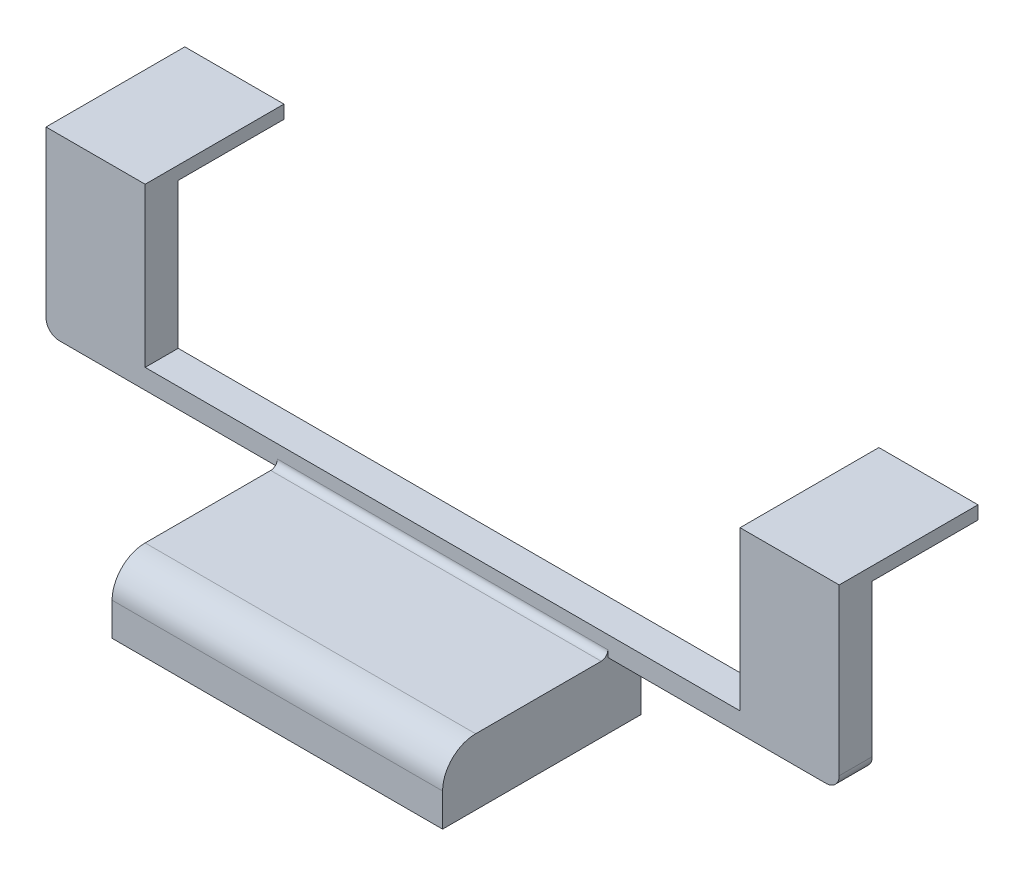
ISO-10303-21;
HEADER;
FILE_DESCRIPTION(('STEP AP214'),'2;1');
FILE_NAME('part.step','',(''),(''),'','','');
FILE_SCHEMA(('AUTOMOTIVE_DESIGN { 1 0 10303 214 1 1 1 1 }'));
ENDSEC;
DATA;
#1=APPLICATION_CONTEXT('core data for automotive mechanical design processes');
#2=APPLICATION_PROTOCOL_DEFINITION('international standard','automotive_design',2000,#1);
#3=PRODUCT_CONTEXT('',#1,'mechanical');
#4=PRODUCT('Part','Part','',(#3));
#5=PRODUCT_RELATED_PRODUCT_CATEGORY('part','',(#4));
#6=PRODUCT_DEFINITION_FORMATION('','',#4);
#7=PRODUCT_DEFINITION_CONTEXT('part definition',#1,'design');
#8=PRODUCT_DEFINITION('design','',#6,#7);
#9=PRODUCT_DEFINITION_SHAPE('','',#8);
#10=(LENGTH_UNIT() NAMED_UNIT(*) SI_UNIT(.MILLI.,.METRE.));
#11=(NAMED_UNIT(*) PLANE_ANGLE_UNIT() SI_UNIT($,.RADIAN.));
#12=(NAMED_UNIT(*) SI_UNIT($,.STERADIAN.) SOLID_ANGLE_UNIT());
#13=UNCERTAINTY_MEASURE_WITH_UNIT(LENGTH_MEASURE(1.E-05),#10,'distance_accuracy_value','');
#14=(GEOMETRIC_REPRESENTATION_CONTEXT(3) GLOBAL_UNCERTAINTY_ASSIGNED_CONTEXT((#13)) GLOBAL_UNIT_ASSIGNED_CONTEXT((#10,
#11,#12)) REPRESENTATION_CONTEXT('',''));
#15=CARTESIAN_POINT('',(0.,0.,0.));
#16=DIRECTION('',(0.,0.,1.));
#17=DIRECTION('',(1.,0.,0.));
#18=AXIS2_PLACEMENT_3D('',#15,#16,#17);
#19=CARTESIAN_POINT('',(-55.7739775783873,3.,26.4775882041113));
#20=DIRECTION('',(0.,0.,1.));
#21=DIRECTION('',(1.,0.,0.));
#22=AXIS2_PLACEMENT_3D('',#19,#20,#21);
#23=PLANE('',#22);
#24=DIRECTION('',(-1.,0.,0.));
#25=VECTOR('',#24,1.);
#26=CARTESIAN_POINT('',(-55.7739775783873,25.,26.4775882041113));
#27=LINE('',#26,#25);
#28=CARTESIAN_POINT('',(-40.7739775783873,25.,26.4775882041113));
#29=VERTEX_POINT('',#28);
#30=CARTESIAN_POINT('',(-55.7739775783873,25.,26.4775882041113));
#31=VERTEX_POINT('',#30);
#32=EDGE_CURVE('E227',#29,#31,#27,.T.);
#33=ORIENTED_EDGE('',*,*,#32,.F.);
#34=DIRECTION('',(0.,-1.,0.));
#35=VECTOR('',#34,1.);
#36=CARTESIAN_POINT('',(-40.7739775783873,27.,26.4775882041113));
#37=LINE('',#36,#35);
#38=CARTESIAN_POINT('',(-40.7739775783873,3.,26.4775882041113));
#39=VERTEX_POINT('',#38);
#40=EDGE_CURVE('E334',#29,#39,#37,.T.);
#41=ORIENTED_EDGE('',*,*,#40,.T.);
#42=DIRECTION('',(-1.,0.,0.));
#43=VECTOR('',#42,1.);
#44=CARTESIAN_POINT('',(-55.7739775783873,3.,26.4775882041113));
#45=LINE('',#44,#43);
#46=CARTESIAN_POINT('',(49.2260224216127,3.,26.4775882041113));
#47=VERTEX_POINT('',#46);
#48=EDGE_CURVE('E344',#47,#39,#45,.T.);
#49=ORIENTED_EDGE('',*,*,#48,.F.);
#50=DIRECTION('',(0.,-1.,0.));
#51=VECTOR('',#50,1.);
#52=CARTESIAN_POINT('',(49.2260224216127,27.,26.4775882041113));
#53=LINE('',#52,#51);
#54=CARTESIAN_POINT('',(49.2260224216127,25.,26.4775882041113));
#55=VERTEX_POINT('',#54);
#56=EDGE_CURVE('E326',#55,#47,#53,.T.);
#57=ORIENTED_EDGE('',*,*,#56,.F.);
#58=DIRECTION('',(-1.,0.,0.));
#59=VECTOR('',#58,1.);
#60=CARTESIAN_POINT('',(64.2260224216127,25.,26.4775882041113));
#61=LINE('',#60,#59);
#62=CARTESIAN_POINT('',(64.2260224216127,25.,26.4775882041113));
#63=VERTEX_POINT('',#62);
#64=EDGE_CURVE('E50',#63,#55,#61,.T.);
#65=ORIENTED_EDGE('',*,*,#64,.F.);
#66=DIRECTION('',(0.,-1.,0.));
#67=VECTOR('',#66,1.);
#68=CARTESIAN_POINT('',(64.2260224216127,3.,26.4775882041113));
#69=LINE('',#68,#67);
#70=CARTESIAN_POINT('',(64.2260224216127,2.,26.4775882041113));
#71=VERTEX_POINT('',#70);
#72=EDGE_CURVE('E354',#63,#71,#69,.T.);
#73=ORIENTED_EDGE('',*,*,#72,.T.);
#74=CARTESIAN_POINT('',(62.2260224216127,2.,26.4775882041113));
#75=DIRECTION('',(0.,0.,1.));
#76=DIRECTION('',(1.,0.,0.));
#77=AXIS2_PLACEMENT_3D('',#74,#75,#76);
#78=CIRCLE('',#77,2.);
#79=CARTESIAN_POINT('',(62.2260224216127,0.,26.4775882041113));
#80=VERTEX_POINT('',#79);
#81=EDGE_CURVE('E389',#71,#80,#78,.F.);
#82=ORIENTED_EDGE('',*,*,#81,.T.);
#83=DIRECTION('',(-1.,0.,0.));
#84=VECTOR('',#83,1.);
#85=CARTESIAN_POINT('',(-55.7739775783873,0.,26.4775882041113));
#86=LINE('',#85,#84);
#87=CARTESIAN_POINT('',(29.2260224216127,0.,26.4775882041113));
#88=VERTEX_POINT('',#87);
#89=EDGE_CURVE('E345',#80,#88,#86,.T.);
#90=ORIENTED_EDGE('',*,*,#89,.T.);
#91=DIRECTION('',(0.,1.,0.));
#92=VECTOR('',#91,1.);
#93=CARTESIAN_POINT('',(29.2260224216127,-10.,26.4775882041113));
#94=LINE('',#93,#92);
#95=CARTESIAN_POINT('',(29.2260224216127,-10.,26.4775882041113));
#96=VERTEX_POINT('',#95);
#97=EDGE_CURVE('E307',#96,#88,#94,.T.);
#98=ORIENTED_EDGE('',*,*,#97,.F.);
#99=DIRECTION('',(1.,0.,0.));
#100=VECTOR('',#99,1.);
#101=CARTESIAN_POINT('',(29.2260224216127,-10.,26.4775882041113));
#102=LINE('',#101,#100);
#103=CARTESIAN_POINT('',(-20.7739775783873,-10.,26.4775882041113));
#104=VERTEX_POINT('',#103);
#105=EDGE_CURVE('E289',#104,#96,#102,.T.);
#106=ORIENTED_EDGE('',*,*,#105,.F.);
#107=DIRECTION('',(0.,1.,0.));
#108=VECTOR('',#107,1.);
#109=CARTESIAN_POINT('',(-20.7739775783873,-10.,26.4775882041113));
#110=LINE('',#109,#108);
#111=CARTESIAN_POINT('',(-20.7739775783873,0.,26.4775882041113));
#112=VERTEX_POINT('',#111);
#113=EDGE_CURVE('E310',#104,#112,#110,.T.);
#114=ORIENTED_EDGE('',*,*,#113,.T.);
#115=CARTESIAN_POINT('',(-53.7739775783873,0.,26.4775882041113));
#116=VERTEX_POINT('',#115);
#117=EDGE_CURVE('E351',#112,#116,#86,.T.);
#118=ORIENTED_EDGE('',*,*,#117,.T.);
#119=CARTESIAN_POINT('',(-53.7739775783873,2.,26.4775882041113));
#120=DIRECTION('',(0.,0.,1.));
#121=DIRECTION('',(1.,0.,0.));
#122=AXIS2_PLACEMENT_3D('',#119,#120,#121);
#123=CIRCLE('',#122,2.);
#124=CARTESIAN_POINT('',(-55.7739775783873,2.,26.4775882041113));
#125=VERTEX_POINT('',#124);
#126=EDGE_CURVE('E11',#116,#125,#123,.F.);
#127=ORIENTED_EDGE('',*,*,#126,.T.);
#128=DIRECTION('',(0.,-1.,0.));
#129=VECTOR('',#128,1.);
#130=CARTESIAN_POINT('',(-55.7739775783873,3.,26.4775882041113));
#131=LINE('',#130,#129);
#132=EDGE_CURVE('E348',#31,#125,#131,.T.);
#133=ORIENTED_EDGE('',*,*,#132,.F.);
#134=EDGE_LOOP('',(#33,#41,#49,#57,#65,#73,#82,#90,#98,#106,#114,#118,#127,#133));
#135=FACE_BOUND('',#134,.T.);
#136=ADVANCED_FACE('F35',(#135),#23,.F.);
#137=CARTESIAN_POINT('',(0.,0.,0.));
#138=DIRECTION('',(0.,-1.,0.));
#139=DIRECTION('',(0.,0.,-1.));
#140=AXIS2_PLACEMENT_3D('',#137,#138,#139);
#141=PLANE('',#140);
#142=DIRECTION('',(1.,0.,0.));
#143=VECTOR('',#142,1.);
#144=CARTESIAN_POINT('',(64.2260224216127,0.,31.4775882041113));
#145=LINE('',#144,#143);
#146=CARTESIAN_POINT('',(-53.7739775783873,0.,31.4775882041113));
#147=VERTEX_POINT('',#146);
#148=CARTESIAN_POINT('',(-20.7739775783873,0.,31.4775882041113));
#149=VERTEX_POINT('',#148);
#150=EDGE_CURVE('E349',#147,#149,#145,.T.);
#151=ORIENTED_EDGE('',*,*,#150,.F.);
#152=DIRECTION('',(0.,0.,1.));
#153=VECTOR('',#152,1.);
#154=CARTESIAN_POINT('',(-53.7739775783873,0.,26.4775882041113));
#155=LINE('',#154,#153);
#156=EDGE_CURVE('E43',#147,#116,#155,.F.);
#157=ORIENTED_EDGE('',*,*,#156,.T.);
#158=ORIENTED_EDGE('',*,*,#117,.F.);
#159=DIRECTION('',(0.,0.,-1.));
#160=VECTOR('',#159,1.);
#161=CARTESIAN_POINT('',(-20.7739775783873,0.,26.4775882041113));
#162=LINE('',#161,#160);
#163=EDGE_CURVE('E299',#149,#112,#162,.T.);
#164=ORIENTED_EDGE('',*,*,#163,.F.);
#165=EDGE_LOOP('',(#151,#157,#158,#164));
#166=FACE_BOUND('',#165,.T.);
#167=ADVANCED_FACE('F403',(#166),#141,.T.);
#168=CARTESIAN_POINT('',(0.,3.,0.));
#169=DIRECTION('',(0.,-1.,0.));
#170=DIRECTION('',(0.,0.,-1.));
#171=AXIS2_PLACEMENT_3D('',#168,#169,#170);
#172=PLANE('',#171);
#173=DIRECTION('',(0.,0.,1.));
#174=VECTOR('',#173,1.);
#175=CARTESIAN_POINT('',(49.2260224216127,3.,26.4775882041113));
#176=LINE('',#175,#174);
#177=CARTESIAN_POINT('',(49.2260224216127,3.,31.4775882041113));
#178=VERTEX_POINT('',#177);
#179=EDGE_CURVE('E313',#47,#178,#176,.T.);
#180=ORIENTED_EDGE('',*,*,#179,.F.);
#181=ORIENTED_EDGE('',*,*,#48,.T.);
#182=DIRECTION('',(0.,0.,-1.));
#183=VECTOR('',#182,1.);
#184=CARTESIAN_POINT('',(-40.7739775783873,3.,26.4775882041113));
#185=LINE('',#184,#183);
#186=CARTESIAN_POINT('',(-40.7739775783873,3.,31.4775882041113));
#187=VERTEX_POINT('',#186);
#188=EDGE_CURVE('E328',#187,#39,#185,.T.);
#189=ORIENTED_EDGE('',*,*,#188,.F.);
#190=DIRECTION('',(1.,0.,0.));
#191=VECTOR('',#190,1.);
#192=CARTESIAN_POINT('',(64.2260224216127,3.,31.4775882041113));
#193=LINE('',#192,#191);
#194=EDGE_CURVE('E342',#187,#178,#193,.T.);
#195=ORIENTED_EDGE('',*,*,#194,.T.);
#196=EDGE_LOOP('',(#180,#181,#189,#195));
#197=FACE_BOUND('',#196,.T.);
#198=ADVANCED_FACE('F426',(#197),#172,.F.);
#199=CARTESIAN_POINT('',(-55.7739775783873,3.,31.4775882041113));
#200=DIRECTION('',(1.,0.,0.));
#201=DIRECTION('',(0.,0.,-1.));
#202=AXIS2_PLACEMENT_3D('',#199,#200,#201);
#203=PLANE('',#202);
#204=DIRECTION('',(0.,0.,1.));
#205=VECTOR('',#204,1.);
#206=CARTESIAN_POINT('',(-55.7739775783873,27.,31.4775882041113));
#207=LINE('',#206,#205);
#208=CARTESIAN_POINT('',(-55.7739775783873,27.,10.4775882041113));
#209=VERTEX_POINT('',#208);
#210=CARTESIAN_POINT('',(-55.7739775783873,27.,31.4775882041113));
#211=VERTEX_POINT('',#210);
#212=EDGE_CURVE('E214',#209,#211,#207,.T.);
#213=ORIENTED_EDGE('',*,*,#212,.F.);
#214=DIRECTION('',(0.,1.,0.));
#215=VECTOR('',#214,1.);
#216=CARTESIAN_POINT('',(-55.7739775783873,27.,10.4775882041113));
#217=LINE('',#216,#215);
#218=CARTESIAN_POINT('',(-55.7739775783873,25.,10.4775882041113));
#219=VERTEX_POINT('',#218);
#220=EDGE_CURVE('E207',#219,#209,#217,.T.);
#221=ORIENTED_EDGE('',*,*,#220,.F.);
#222=DIRECTION('',(0.,0.,1.));
#223=VECTOR('',#222,1.);
#224=CARTESIAN_POINT('',(-55.7739775783873,25.,10.4775882041113));
#225=LINE('',#224,#223);
#226=EDGE_CURVE('E211',#219,#31,#225,.T.);
#227=ORIENTED_EDGE('',*,*,#226,.T.);
#228=ORIENTED_EDGE('',*,*,#132,.T.);
#229=DIRECTION('',(0.,0.,1.));
#230=VECTOR('',#229,1.);
#231=CARTESIAN_POINT('',(-55.7739775783873,2.,31.4775882041113));
#232=LINE('',#231,#230);
#233=CARTESIAN_POINT('',(-55.7739775783873,2.,31.4775882041113));
#234=VERTEX_POINT('',#233);
#235=EDGE_CURVE('E395',#125,#234,#232,.T.);
#236=ORIENTED_EDGE('',*,*,#235,.T.);
#237=DIRECTION('',(0.,-1.,0.));
#238=VECTOR('',#237,1.);
#239=CARTESIAN_POINT('',(-55.7739775783873,3.,31.4775882041113));
#240=LINE('',#239,#238);
#241=EDGE_CURVE('E359',#211,#234,#240,.T.);
#242=ORIENTED_EDGE('',*,*,#241,.F.);
#243=EDGE_LOOP('',(#213,#221,#227,#228,#236,#242));
#244=FACE_BOUND('',#243,.T.);
#245=ADVANCED_FACE('F209',(#244),#203,.F.);
#246=CARTESIAN_POINT('',(64.2260224216127,3.,31.4775882041113));
#247=DIRECTION('',(0.,0.,-1.));
#248=DIRECTION('',(-1.,0.,0.));
#249=AXIS2_PLACEMENT_3D('',#246,#247,#248);
#250=PLANE('',#249);
#251=ORIENTED_EDGE('',*,*,#241,.T.);
#252=CARTESIAN_POINT('',(-53.7739775783873,2.,31.4775882041113));
#253=DIRECTION('',(0.,0.,-1.));
#254=DIRECTION('',(-1.,0.,0.));
#255=AXIS2_PLACEMENT_3D('',#252,#253,#254);
#256=CIRCLE('',#255,2.);
#257=EDGE_CURVE('E398',#234,#147,#256,.F.);
#258=ORIENTED_EDGE('',*,*,#257,.T.);
#259=ORIENTED_EDGE('',*,*,#150,.T.);
#260=DIRECTION('',(0.,1.,0.));
#261=VECTOR('',#260,1.);
#262=CARTESIAN_POINT('',(-20.7739775783873,-10.,31.4775882041113));
#263=LINE('',#262,#261);
#264=CARTESIAN_POINT('',(-20.7739775783873,1.,31.4775882041113));
#265=VERTEX_POINT('',#264);
#266=EDGE_CURVE('E362',#149,#265,#263,.T.);
#267=ORIENTED_EDGE('',*,*,#266,.T.);
#268=DIRECTION('',(1.,0.,0.));
#269=VECTOR('',#268,1.);
#270=CARTESIAN_POINT('',(64.2260224216127,1.,31.4775882041113));
#271=LINE('',#270,#269);
#272=CARTESIAN_POINT('',(29.2260224216127,1.,31.4775882041113));
#273=VERTEX_POINT('',#272);
#274=EDGE_CURVE('E365',#265,#273,#271,.T.);
#275=ORIENTED_EDGE('',*,*,#274,.T.);
#276=DIRECTION('',(0.,-1.,0.));
#277=VECTOR('',#276,1.);
#278=CARTESIAN_POINT('',(29.2260224216127,-10.,31.4775882041113));
#279=LINE('',#278,#277);
#280=CARTESIAN_POINT('',(29.2260224216127,0.,31.4775882041113));
#281=VERTEX_POINT('',#280);
#282=EDGE_CURVE('E368',#273,#281,#279,.T.);
#283=ORIENTED_EDGE('',*,*,#282,.T.);
#284=CARTESIAN_POINT('',(62.2260224216127,0.,31.4775882041113));
#285=VERTEX_POINT('',#284);
#286=EDGE_CURVE('E341',#281,#285,#145,.T.);
#287=ORIENTED_EDGE('',*,*,#286,.T.);
#288=CARTESIAN_POINT('',(62.2260224216127,2.,31.4775882041113));
#289=DIRECTION('',(0.,0.,-1.));
#290=DIRECTION('',(-1.,0.,0.));
#291=AXIS2_PLACEMENT_3D('',#288,#289,#290);
#292=CIRCLE('',#291,2.);
#293=CARTESIAN_POINT('',(64.2260224216127,2.,31.4775882041113));
#294=VERTEX_POINT('',#293);
#295=EDGE_CURVE('E393',#285,#294,#292,.F.);
#296=ORIENTED_EDGE('',*,*,#295,.T.);
#297=DIRECTION('',(0.,-1.,0.));
#298=VECTOR('',#297,1.);
#299=CARTESIAN_POINT('',(64.2260224216127,3.,31.4775882041113));
#300=LINE('',#299,#298);
#301=CARTESIAN_POINT('',(64.2260224216127,27.,31.4775882041113));
#302=VERTEX_POINT('',#301);
#303=EDGE_CURVE('E356',#302,#294,#300,.T.);
#304=ORIENTED_EDGE('',*,*,#303,.F.);
#305=DIRECTION('',(1.,0.,0.));
#306=VECTOR('',#305,1.);
#307=CARTESIAN_POINT('',(49.2260224216127,27.,31.4775882041113));
#308=LINE('',#307,#306);
#309=CARTESIAN_POINT('',(49.2260224216127,27.,31.4775882041113));
#310=VERTEX_POINT('',#309);
#311=EDGE_CURVE('E318',#310,#302,#308,.T.);
#312=ORIENTED_EDGE('',*,*,#311,.F.);
#313=DIRECTION('',(0.,-1.,0.));
#314=VECTOR('',#313,1.);
#315=CARTESIAN_POINT('',(49.2260224216127,27.,31.4775882041113));
#316=LINE('',#315,#314);
#317=EDGE_CURVE('E321',#310,#178,#316,.T.);
#318=ORIENTED_EDGE('',*,*,#317,.T.);
#319=ORIENTED_EDGE('',*,*,#194,.F.);
#320=DIRECTION('',(0.,-1.,0.));
#321=VECTOR('',#320,1.);
#322=CARTESIAN_POINT('',(-40.7739775783873,27.,31.4775882041113));
#323=LINE('',#322,#321);
#324=CARTESIAN_POINT('',(-40.7739775783873,27.,31.4775882041113));
#325=VERTEX_POINT('',#324);
#326=EDGE_CURVE('E338',#325,#187,#323,.T.);
#327=ORIENTED_EDGE('',*,*,#326,.F.);
#328=DIRECTION('',(1.,0.,0.));
#329=VECTOR('',#328,1.);
#330=CARTESIAN_POINT('',(-40.7739775783873,27.,31.4775882041113));
#331=LINE('',#330,#329);
#332=EDGE_CURVE('E330',#211,#325,#331,.T.);
#333=ORIENTED_EDGE('',*,*,#332,.F.);
#334=EDGE_LOOP('',(#251,#258,#259,#267,#275,#283,#287,#296,#304,#312,#318,#319,#327,#333));
#335=FACE_BOUND('',#334,.T.);
#336=ADVANCED_FACE('F412',(#335),#250,.F.);
#337=CARTESIAN_POINT('',(64.2260224216127,3.,26.4775882041113));
#338=DIRECTION('',(-1.,0.,0.));
#339=DIRECTION('',(0.,0.,1.));
#340=AXIS2_PLACEMENT_3D('',#337,#338,#339);
#341=PLANE('',#340);
#342=ORIENTED_EDGE('',*,*,#303,.T.);
#343=DIRECTION('',(0.,0.,-1.));
#344=VECTOR('',#343,1.);
#345=CARTESIAN_POINT('',(64.2260224216127,2.,26.4775882041113));
#346=LINE('',#345,#344);
#347=EDGE_CURVE('E386',#294,#71,#346,.T.);
#348=ORIENTED_EDGE('',*,*,#347,.T.);
#349=ORIENTED_EDGE('',*,*,#72,.F.);
#350=DIRECTION('',(0.,0.,1.));
#351=VECTOR('',#350,1.);
#352=CARTESIAN_POINT('',(64.2260224216127,25.,10.4775882041113));
#353=LINE('',#352,#351);
#354=CARTESIAN_POINT('',(64.2260224216127,25.,10.4775882041113));
#355=VERTEX_POINT('',#354);
#356=EDGE_CURVE('E252',#355,#63,#353,.T.);
#357=ORIENTED_EDGE('',*,*,#356,.F.);
#358=DIRECTION('',(0.,-1.,0.));
#359=VECTOR('',#358,1.);
#360=CARTESIAN_POINT('',(64.2260224216127,27.,10.4775882041113));
#361=LINE('',#360,#359);
#362=CARTESIAN_POINT('',(64.2260224216127,27.,10.4775882041113));
#363=VERTEX_POINT('',#362);
#364=EDGE_CURVE('E234',#363,#355,#361,.T.);
#365=ORIENTED_EDGE('',*,*,#364,.F.);
#366=DIRECTION('',(0.,0.,-1.));
#367=VECTOR('',#366,1.);
#368=CARTESIAN_POINT('',(64.2260224216127,27.,31.4775882041113));
#369=LINE('',#368,#367);
#370=EDGE_CURVE('E314',#302,#363,#369,.T.);
#371=ORIENTED_EDGE('',*,*,#370,.F.);
#372=EDGE_LOOP('',(#342,#348,#349,#357,#365,#371));
#373=FACE_BOUND('',#372,.T.);
#374=ADVANCED_FACE('F437',(#373),#341,.F.);
#375=ORIENTED_EDGE('',*,*,#89,.F.);
#376=DIRECTION('',(0.,0.,-1.));
#377=VECTOR('',#376,1.);
#378=CARTESIAN_POINT('',(62.2260224216127,0.,31.4775882041113));
#379=LINE('',#378,#377);
#380=EDGE_CURVE('E391',#80,#285,#379,.F.);
#381=ORIENTED_EDGE('',*,*,#380,.T.);
#382=ORIENTED_EDGE('',*,*,#286,.F.);
#383=DIRECTION('',(0.,0.,1.));
#384=VECTOR('',#383,1.);
#385=CARTESIAN_POINT('',(29.2260224216127,0.,56.4775882041113));
#386=LINE('',#385,#384);
#387=EDGE_CURVE('E290',#88,#281,#386,.T.);
#388=ORIENTED_EDGE('',*,*,#387,.F.);
#389=EDGE_LOOP('',(#375,#381,#382,#388));
#390=FACE_BOUND('',#389,.T.);
#391=ADVANCED_FACE('F463',(#390),#141,.T.);
#392=CARTESIAN_POINT('',(-40.7739775783873,27.,26.4775882041113));
#393=DIRECTION('',(-1.,0.,0.));
#394=DIRECTION('',(0.,0.,1.));
#395=AXIS2_PLACEMENT_3D('',#392,#393,#394);
#396=PLANE('',#395);
#397=ORIENTED_EDGE('',*,*,#188,.T.);
#398=ORIENTED_EDGE('',*,*,#40,.F.);
#399=DIRECTION('',(0.,0.,1.));
#400=VECTOR('',#399,1.);
#401=CARTESIAN_POINT('',(-40.7739775783873,25.,10.4775882041113));
#402=LINE('',#401,#400);
#403=CARTESIAN_POINT('',(-40.7739775783873,25.,10.4775882041113));
#404=VERTEX_POINT('',#403);
#405=EDGE_CURVE('E232',#404,#29,#402,.T.);
#406=ORIENTED_EDGE('',*,*,#405,.F.);
#407=DIRECTION('',(0.,-1.,0.));
#408=VECTOR('',#407,1.);
#409=CARTESIAN_POINT('',(-40.7739775783873,25.,10.4775882041113));
#410=LINE('',#409,#408);
#411=CARTESIAN_POINT('',(-40.7739775783873,27.,10.4775882041113));
#412=VERTEX_POINT('',#411);
#413=EDGE_CURVE('E224',#412,#404,#410,.T.);
#414=ORIENTED_EDGE('',*,*,#413,.F.);
#415=DIRECTION('',(0.,0.,-1.));
#416=VECTOR('',#415,1.);
#417=CARTESIAN_POINT('',(-40.7739775783873,27.,26.4775882041113));
#418=LINE('',#417,#416);
#419=EDGE_CURVE('E332',#325,#412,#418,.T.);
#420=ORIENTED_EDGE('',*,*,#419,.F.);
#421=ORIENTED_EDGE('',*,*,#326,.T.);
#422=EDGE_LOOP('',(#397,#398,#406,#414,#420,#421));
#423=FACE_BOUND('',#422,.T.);
#424=ADVANCED_FACE('F421',(#423),#396,.F.);
#425=CARTESIAN_POINT('',(0.,27.,0.));
#426=DIRECTION('',(0.,-1.,0.));
#427=DIRECTION('',(0.,0.,-1.));
#428=AXIS2_PLACEMENT_3D('',#425,#426,#427);
#429=PLANE('',#428);
#430=ORIENTED_EDGE('',*,*,#212,.T.);
#431=ORIENTED_EDGE('',*,*,#332,.T.);
#432=ORIENTED_EDGE('',*,*,#419,.T.);
#433=DIRECTION('',(1.,0.,0.));
#434=VECTOR('',#433,1.);
#435=CARTESIAN_POINT('',(-40.7739775783873,27.,10.4775882041113));
#436=LINE('',#435,#434);
#437=EDGE_CURVE('E218',#209,#412,#436,.T.);
#438=ORIENTED_EDGE('',*,*,#437,.F.);
#439=EDGE_LOOP('',(#430,#431,#432,#438));
#440=FACE_BOUND('',#439,.T.);
#441=ADVANCED_FACE('F417',(#440),#429,.F.);
#442=CARTESIAN_POINT('',(49.2260224216127,27.,26.4775882041113));
#443=DIRECTION('',(1.,0.,0.));
#444=DIRECTION('',(0.,0.,-1.));
#445=AXIS2_PLACEMENT_3D('',#442,#443,#444);
#446=PLANE('',#445);
#447=ORIENTED_EDGE('',*,*,#179,.T.);
#448=ORIENTED_EDGE('',*,*,#317,.F.);
#449=DIRECTION('',(0.,0.,1.));
#450=VECTOR('',#449,1.);
#451=CARTESIAN_POINT('',(49.2260224216127,27.,26.4775882041113));
#452=LINE('',#451,#450);
#453=CARTESIAN_POINT('',(49.2260224216127,27.,10.4775882041113));
#454=VERTEX_POINT('',#453);
#455=EDGE_CURVE('E316',#454,#310,#452,.T.);
#456=ORIENTED_EDGE('',*,*,#455,.F.);
#457=DIRECTION('',(0.,1.,0.));
#458=VECTOR('',#457,1.);
#459=CARTESIAN_POINT('',(49.2260224216127,25.,10.4775882041113));
#460=LINE('',#459,#458);
#461=CARTESIAN_POINT('',(49.2260224216127,25.,10.4775882041113));
#462=VERTEX_POINT('',#461);
#463=EDGE_CURVE('E243',#462,#454,#460,.T.);
#464=ORIENTED_EDGE('',*,*,#463,.F.);
#465=DIRECTION('',(0.,0.,1.));
#466=VECTOR('',#465,1.);
#467=CARTESIAN_POINT('',(49.2260224216127,25.,10.4775882041113));
#468=LINE('',#467,#466);
#469=EDGE_CURVE('E248',#462,#55,#468,.T.);
#470=ORIENTED_EDGE('',*,*,#469,.T.);
#471=ORIENTED_EDGE('',*,*,#56,.T.);
#472=EDGE_LOOP('',(#447,#448,#456,#464,#470,#471));
#473=FACE_BOUND('',#472,.T.);
#474=ADVANCED_FACE('F429',(#473),#446,.F.);
#475=CARTESIAN_POINT('',(0.,27.,0.));
#476=DIRECTION('',(0.,1.,0.));
#477=DIRECTION('',(0.,0.,1.));
#478=AXIS2_PLACEMENT_3D('',#475,#476,#477);
#479=PLANE('',#478);
#480=ORIENTED_EDGE('',*,*,#370,.T.);
#481=DIRECTION('',(1.,0.,0.));
#482=VECTOR('',#481,1.);
#483=CARTESIAN_POINT('',(49.2260224216127,27.,10.4775882041113));
#484=LINE('',#483,#482);
#485=EDGE_CURVE('E246',#454,#363,#484,.T.);
#486=ORIENTED_EDGE('',*,*,#485,.F.);
#487=ORIENTED_EDGE('',*,*,#455,.T.);
#488=ORIENTED_EDGE('',*,*,#311,.T.);
#489=EDGE_LOOP('',(#480,#486,#487,#488));
#490=FACE_BOUND('',#489,.T.);
#491=ADVANCED_FACE('F433',(#490),#479,.T.);
#492=CARTESIAN_POINT('',(0.,0.,0.));
#493=DIRECTION('',(0.,1.,0.));
#494=DIRECTION('',(0.,0.,1.));
#495=AXIS2_PLACEMENT_3D('',#492,#493,#494);
#496=PLANE('',#495);
#497=CARTESIAN_POINT('',(-20.7739775783873,0.,51.4775882041113));
#498=VERTEX_POINT('',#497);
#499=CARTESIAN_POINT('',(-20.7739775783873,0.,32.4775882041113));
#500=VERTEX_POINT('',#499);
#501=EDGE_CURVE('E280',#498,#500,#162,.T.);
#502=ORIENTED_EDGE('',*,*,#501,.F.);
#503=DIRECTION('',(-1.,0.,0.));
#504=VECTOR('',#503,1.);
#505=CARTESIAN_POINT('',(29.2260224216127,0.,51.4775882041113));
#506=LINE('',#505,#504);
#507=CARTESIAN_POINT('',(29.2260224216127,0.,51.4775882041113));
#508=VERTEX_POINT('',#507);
#509=EDGE_CURVE('E382',#498,#508,#506,.F.);
#510=ORIENTED_EDGE('',*,*,#509,.T.);
#511=CARTESIAN_POINT('',(29.2260224216127,0.,32.4775882041113));
#512=VERTEX_POINT('',#511);
#513=EDGE_CURVE('E298',#512,#508,#386,.T.);
#514=ORIENTED_EDGE('',*,*,#513,.F.);
#515=DIRECTION('',(1.,0.,0.));
#516=VECTOR('',#515,1.);
#517=CARTESIAN_POINT('',(0.,0.,32.4775882041113));
#518=LINE('',#517,#516);
#519=EDGE_CURVE('E370',#512,#500,#518,.F.);
#520=ORIENTED_EDGE('',*,*,#519,.T.);
#521=EDGE_LOOP('',(#502,#510,#514,#520));
#522=FACE_BOUND('',#521,.T.);
#523=ADVANCED_FACE('F516',(#522),#496,.T.);
#524=CARTESIAN_POINT('',(-20.7739775783873,-10.,26.4775882041113));
#525=DIRECTION('',(1.,0.,0.));
#526=DIRECTION('',(0.,0.,-1.));
#527=AXIS2_PLACEMENT_3D('',#524,#525,#526);
#528=PLANE('',#527);
#529=DIRECTION('',(0.,1.,0.));
#530=VECTOR('',#529,1.);
#531=CARTESIAN_POINT('',(-20.7739775783873,-10.,56.4775882041113));
#532=LINE('',#531,#530);
#533=CARTESIAN_POINT('',(-20.7739775783873,-10.,56.4775882041113));
#534=VERTEX_POINT('',#533);
#535=CARTESIAN_POINT('',(-20.7739775783873,-5.,56.4775882041113));
#536=VERTEX_POINT('',#535);
#537=EDGE_CURVE('E296',#534,#536,#532,.T.);
#538=ORIENTED_EDGE('',*,*,#537,.T.);
#539=CARTESIAN_POINT('',(-20.7739775783873,-5.,51.4775882041113));
#540=DIRECTION('',(1.,0.,0.));
#541=DIRECTION('',(0.,0.,-1.));
#542=AXIS2_PLACEMENT_3D('',#539,#540,#541);
#543=CIRCLE('',#542,5.);
#544=EDGE_CURVE('E380',#536,#498,#543,.F.);
#545=ORIENTED_EDGE('',*,*,#544,.T.);
#546=ORIENTED_EDGE('',*,*,#501,.T.);
#547=CARTESIAN_POINT('',(-20.7739775783873,1.,32.4775882041113));
#548=DIRECTION('',(1.,0.,0.));
#549=DIRECTION('',(0.,0.,-1.));
#550=AXIS2_PLACEMENT_3D('',#547,#548,#549);
#551=CIRCLE('',#550,1.);
#552=EDGE_CURVE('E375',#500,#265,#551,.T.);
#553=ORIENTED_EDGE('',*,*,#552,.T.);
#554=ORIENTED_EDGE('',*,*,#266,.F.);
#555=ORIENTED_EDGE('',*,*,#163,.T.);
#556=ORIENTED_EDGE('',*,*,#113,.F.);
#557=DIRECTION('',(0.,0.,-1.));
#558=VECTOR('',#557,1.);
#559=CARTESIAN_POINT('',(-20.7739775783873,-10.,26.4775882041113));
#560=LINE('',#559,#558);
#561=EDGE_CURVE('E286',#534,#104,#560,.T.);
#562=ORIENTED_EDGE('',*,*,#561,.F.);
#563=EDGE_LOOP('',(#538,#545,#546,#553,#554,#555,#556,#562));
#564=FACE_BOUND('',#563,.T.);
#565=ADVANCED_FACE('F507',(#564),#528,.F.);
#566=CARTESIAN_POINT('',(29.2260224216127,-10.,56.4775882041113));
#567=DIRECTION('',(-1.,0.,0.));
#568=DIRECTION('',(0.,0.,1.));
#569=AXIS2_PLACEMENT_3D('',#566,#567,#568);
#570=PLANE('',#569);
#571=ORIENTED_EDGE('',*,*,#513,.T.);
#572=CARTESIAN_POINT('',(29.2260224216127,-5.,51.4775882041113));
#573=DIRECTION('',(-1.,0.,0.));
#574=DIRECTION('',(0.,0.,1.));
#575=AXIS2_PLACEMENT_3D('',#572,#573,#574);
#576=CIRCLE('',#575,5.);
#577=CARTESIAN_POINT('',(29.2260224216127,-5.,56.4775882041113));
#578=VERTEX_POINT('',#577);
#579=EDGE_CURVE('E384',#508,#578,#576,.F.);
#580=ORIENTED_EDGE('',*,*,#579,.T.);
#581=DIRECTION('',(0.,1.,0.));
#582=VECTOR('',#581,1.);
#583=CARTESIAN_POINT('',(29.2260224216127,-10.,56.4775882041113));
#584=LINE('',#583,#582);
#585=CARTESIAN_POINT('',(29.2260224216127,-10.,56.4775882041113));
#586=VERTEX_POINT('',#585);
#587=EDGE_CURVE('E304',#586,#578,#584,.T.);
#588=ORIENTED_EDGE('',*,*,#587,.F.);
#589=DIRECTION('',(0.,0.,1.));
#590=VECTOR('',#589,1.);
#591=CARTESIAN_POINT('',(29.2260224216127,-10.,56.4775882041113));
#592=LINE('',#591,#590);
#593=EDGE_CURVE('E292',#96,#586,#592,.T.);
#594=ORIENTED_EDGE('',*,*,#593,.F.);
#595=ORIENTED_EDGE('',*,*,#97,.T.);
#596=ORIENTED_EDGE('',*,*,#387,.T.);
#597=ORIENTED_EDGE('',*,*,#282,.F.);
#598=CARTESIAN_POINT('',(29.2260224216127,1.,32.4775882041113));
#599=DIRECTION('',(-1.,0.,0.));
#600=DIRECTION('',(0.,0.,1.));
#601=AXIS2_PLACEMENT_3D('',#598,#599,#600);
#602=CIRCLE('',#601,1.);
#603=EDGE_CURVE('E373',#273,#512,#602,.T.);
#604=ORIENTED_EDGE('',*,*,#603,.T.);
#605=EDGE_LOOP('',(#571,#580,#588,#594,#595,#596,#597,#604));
#606=FACE_BOUND('',#605,.T.);
#607=ADVANCED_FACE('F498',(#606),#570,.F.);
#608=CARTESIAN_POINT('',(-20.7739775783873,-10.,56.4775882041113));
#609=DIRECTION('',(0.,0.,-1.));
#610=DIRECTION('',(-1.,0.,0.));
#611=AXIS2_PLACEMENT_3D('',#608,#609,#610);
#612=PLANE('',#611);
#613=ORIENTED_EDGE('',*,*,#587,.T.);
#614=DIRECTION('',(-1.,0.,0.));
#615=VECTOR('',#614,1.);
#616=CARTESIAN_POINT('',(-20.7739775783873,-5.,56.4775882041113));
#617=LINE('',#616,#615);
#618=EDGE_CURVE('E377',#578,#536,#617,.T.);
#619=ORIENTED_EDGE('',*,*,#618,.T.);
#620=ORIENTED_EDGE('',*,*,#537,.F.);
#621=DIRECTION('',(-1.,0.,0.));
#622=VECTOR('',#621,1.);
#623=CARTESIAN_POINT('',(-20.7739775783873,-10.,56.4775882041113));
#624=LINE('',#623,#622);
#625=EDGE_CURVE('E294',#586,#534,#624,.T.);
#626=ORIENTED_EDGE('',*,*,#625,.F.);
#627=EDGE_LOOP('',(#613,#619,#620,#626));
#628=FACE_BOUND('',#627,.T.);
#629=ADVANCED_FACE('F520',(#628),#612,.F.);
#630=CARTESIAN_POINT('',(0.,-10.,0.));
#631=DIRECTION('',(0.,1.,0.));
#632=DIRECTION('',(0.,0.,1.));
#633=AXIS2_PLACEMENT_3D('',#630,#631,#632);
#634=PLANE('',#633);
#635=CARTESIAN_POINT('',(4.2260224216127,-10.,41.4775882041113));
#636=DIRECTION('',(0.,-1.,0.));
#637=DIRECTION('',(0.,0.,-1.));
#638=AXIS2_PLACEMENT_3D('',#635,#636,#637);
#639=CIRCLE('',#638,9.);
#640=CARTESIAN_POINT('',(12.5454668660571,-10.,44.9107855674743));
#641=VERTEX_POINT('',#640);
#642=CARTESIAN_POINT('',(-4.09342202283174,-10.,44.9107855674743));
#643=VERTEX_POINT('',#642);
#644=EDGE_CURVE('E270',#641,#643,#639,.T.);
#645=ORIENTED_EDGE('',*,*,#644,.F.);
#646=CARTESIAN_POINT('',(13.2260224216127,-10.,41.4775882041113));
#647=DIRECTION('',(0.,-1.,0.));
#648=DIRECTION('',(0.,0.,-1.));
#649=AXIS2_PLACEMENT_3D('',#646,#647,#648);
#650=CIRCLE('',#649,3.50000000000001);
#651=CARTESIAN_POINT('',(12.5454668660571,-10.,38.0443908407483));
#652=VERTEX_POINT('',#651);
#653=EDGE_CURVE('E58',#652,#641,#650,.T.);
#654=ORIENTED_EDGE('',*,*,#653,.F.);
#655=CARTESIAN_POINT('',(4.2260224216127,-10.,41.4775882041113));
#656=DIRECTION('',(0.,-1.,0.));
#657=DIRECTION('',(0.,0.,-1.));
#658=AXIS2_PLACEMENT_3D('',#655,#656,#657);
#659=CIRCLE('',#658,9.);
#660=CARTESIAN_POINT('',(-4.09342202283174,-10.,38.0443908407483));
#661=VERTEX_POINT('',#660);
#662=EDGE_CURVE('E259',#661,#652,#659,.T.);
#663=ORIENTED_EDGE('',*,*,#662,.F.);
#664=CARTESIAN_POINT('',(-4.7739775783873,-10.,41.4775882041113));
#665=DIRECTION('',(0.,-1.,0.));
#666=DIRECTION('',(0.,0.,-1.));
#667=AXIS2_PLACEMENT_3D('',#664,#665,#666);
#668=CIRCLE('',#667,3.5);
#669=EDGE_CURVE('E273',#643,#661,#668,.T.);
#670=ORIENTED_EDGE('',*,*,#669,.F.);
#671=EDGE_LOOP('',(#645,#654,#663,#670));
#672=FACE_BOUND('',#671,.T.);
#673=ORIENTED_EDGE('',*,*,#561,.T.);
#674=ORIENTED_EDGE('',*,*,#105,.T.);
#675=ORIENTED_EDGE('',*,*,#593,.T.);
#676=ORIENTED_EDGE('',*,*,#625,.T.);
#677=EDGE_LOOP('',(#673,#674,#675,#676));
#678=FACE_BOUND('',#677,.T.);
#679=ADVANCED_FACE('F476',(#672,#678),#634,.F.);
#680=CARTESIAN_POINT('',(64.2260224216127,1.,32.4775882041113));
#681=DIRECTION('',(1.,0.,0.));
#682=DIRECTION('',(0.,0.,-1.));
#683=AXIS2_PLACEMENT_3D('',#680,#681,#682);
#684=CYLINDRICAL_SURFACE('',#683,1.);
#685=ORIENTED_EDGE('',*,*,#552,.F.);
#686=ORIENTED_EDGE('',*,*,#519,.F.);
#687=ORIENTED_EDGE('',*,*,#603,.F.);
#688=ORIENTED_EDGE('',*,*,#274,.F.);
#689=EDGE_LOOP('',(#685,#686,#687,#688));
#690=FACE_BOUND('',#689,.T.);
#691=ADVANCED_FACE('F472',(#690),#684,.F.);
#692=CARTESIAN_POINT('',(-20.7739775783873,-5.,51.4775882041113));
#693=DIRECTION('',(1.,0.,0.));
#694=DIRECTION('',(0.,0.,-1.));
#695=AXIS2_PLACEMENT_3D('',#692,#693,#694);
#696=CYLINDRICAL_SURFACE('',#695,5.);
#697=ORIENTED_EDGE('',*,*,#579,.F.);
#698=ORIENTED_EDGE('',*,*,#509,.F.);
#699=ORIENTED_EDGE('',*,*,#544,.F.);
#700=ORIENTED_EDGE('',*,*,#618,.F.);
#701=EDGE_LOOP('',(#697,#698,#699,#700));
#702=FACE_BOUND('',#701,.T.);
#703=ADVANCED_FACE('F475',(#702),#696,.T.);
#704=CARTESIAN_POINT('',(62.2260224216127,2.,26.4775882041113));
#705=DIRECTION('',(0.,0.,1.));
#706=DIRECTION('',(1.,0.,0.));
#707=AXIS2_PLACEMENT_3D('',#704,#705,#706);
#708=CYLINDRICAL_SURFACE('',#707,2.);
#709=ORIENTED_EDGE('',*,*,#295,.F.);
#710=ORIENTED_EDGE('',*,*,#380,.F.);
#711=ORIENTED_EDGE('',*,*,#81,.F.);
#712=ORIENTED_EDGE('',*,*,#347,.F.);
#713=EDGE_LOOP('',(#709,#710,#711,#712));
#714=FACE_BOUND('',#713,.T.);
#715=ADVANCED_FACE('F479',(#714),#708,.T.);
#716=CARTESIAN_POINT('',(-53.7739775783873,2.,31.4775882041113));
#717=DIRECTION('',(0.,0.,-1.));
#718=DIRECTION('',(-1.,0.,0.));
#719=AXIS2_PLACEMENT_3D('',#716,#717,#718);
#720=CYLINDRICAL_SURFACE('',#719,2.);
#721=ORIENTED_EDGE('',*,*,#126,.F.);
#722=ORIENTED_EDGE('',*,*,#156,.F.);
#723=ORIENTED_EDGE('',*,*,#257,.F.);
#724=ORIENTED_EDGE('',*,*,#235,.F.);
#725=EDGE_LOOP('',(#721,#722,#723,#724));
#726=FACE_BOUND('',#725,.T.);
#727=ADVANCED_FACE('F37',(#726),#720,.T.);
#728=CARTESIAN_POINT('',(13.2260224216127,-2.,41.4775882041113));
#729=DIRECTION('',(0.,-1.,0.));
#730=DIRECTION('',(0.,0.,-1.));
#731=AXIS2_PLACEMENT_3D('',#728,#729,#730);
#732=CYLINDRICAL_SURFACE('',#731,3.50000000000001);
#733=ORIENTED_EDGE('',*,*,#653,.T.);
#734=DIRECTION('',(0.,-1.,0.));
#735=VECTOR('',#734,1.);
#736=CARTESIAN_POINT('',(12.5454668660571,-2.,44.9107855674743));
#737=LINE('',#736,#735);
#738=CARTESIAN_POINT('',(12.5454668660571,-2.,44.9107855674743));
#739=VERTEX_POINT('',#738);
#740=EDGE_CURVE('E268',#739,#641,#737,.T.);
#741=ORIENTED_EDGE('',*,*,#740,.F.);
#742=CARTESIAN_POINT('',(13.2260224216127,-2.,41.4775882041113));
#743=DIRECTION('',(0.,-1.,0.));
#744=DIRECTION('',(0.,0.,-1.));
#745=AXIS2_PLACEMENT_3D('',#742,#743,#744);
#746=CIRCLE('',#745,3.50000000000001);
#747=CARTESIAN_POINT('',(12.5454668660571,-2.,38.0443908407483));
#748=VERTEX_POINT('',#747);
#749=EDGE_CURVE('E255',#748,#739,#746,.T.);
#750=ORIENTED_EDGE('',*,*,#749,.F.);
#751=DIRECTION('',(0.,-1.,0.));
#752=VECTOR('',#751,1.);
#753=CARTESIAN_POINT('',(12.5454668660571,-2.,38.0443908407483));
#754=LINE('',#753,#752);
#755=EDGE_CURVE('E278',#748,#652,#754,.T.);
#756=ORIENTED_EDGE('',*,*,#755,.T.);
#757=EDGE_LOOP('',(#733,#741,#750,#756));
#758=FACE_BOUND('',#757,.T.);
#759=ADVANCED_FACE('F486',(#758),#732,.F.);
#760=CARTESIAN_POINT('',(4.2260224216127,-2.,41.4775882041113));
#761=DIRECTION('',(0.,-1.,0.));
#762=DIRECTION('',(0.,0.,-1.));
#763=AXIS2_PLACEMENT_3D('',#760,#761,#762);
#764=CYLINDRICAL_SURFACE('',#763,9.);
#765=ORIENTED_EDGE('',*,*,#662,.T.);
#766=ORIENTED_EDGE('',*,*,#755,.F.);
#767=CARTESIAN_POINT('',(4.2260224216127,-2.,41.4775882041113));
#768=DIRECTION('',(0.,-1.,0.));
#769=DIRECTION('',(0.,0.,-1.));
#770=AXIS2_PLACEMENT_3D('',#767,#768,#769);
#771=CIRCLE('',#770,9.);
#772=CARTESIAN_POINT('',(-4.09342202283174,-2.,38.0443908407483));
#773=VERTEX_POINT('',#772);
#774=EDGE_CURVE('E265',#773,#748,#771,.T.);
#775=ORIENTED_EDGE('',*,*,#774,.F.);
#776=DIRECTION('',(0.,-1.,0.));
#777=VECTOR('',#776,1.);
#778=CARTESIAN_POINT('',(-4.09342202283174,-2.,38.0443908407483));
#779=LINE('',#778,#777);
#780=EDGE_CURVE('E281',#773,#661,#779,.T.);
#781=ORIENTED_EDGE('',*,*,#780,.T.);
#782=EDGE_LOOP('',(#765,#766,#775,#781));
#783=FACE_BOUND('',#782,.T.);
#784=ADVANCED_FACE('F625',(#783),#764,.F.);
#785=CARTESIAN_POINT('',(-4.7739775783873,-2.,41.4775882041113));
#786=DIRECTION('',(0.,-1.,0.));
#787=DIRECTION('',(0.,0.,-1.));
#788=AXIS2_PLACEMENT_3D('',#785,#786,#787);
#789=CYLINDRICAL_SURFACE('',#788,3.5);
#790=ORIENTED_EDGE('',*,*,#669,.T.);
#791=ORIENTED_EDGE('',*,*,#780,.F.);
#792=CARTESIAN_POINT('',(-4.7739775783873,-2.,41.4775882041113));
#793=DIRECTION('',(0.,-1.,0.));
#794=DIRECTION('',(0.,0.,-1.));
#795=AXIS2_PLACEMENT_3D('',#792,#793,#794);
#796=CIRCLE('',#795,3.5);
#797=CARTESIAN_POINT('',(-4.09342202283174,-2.,44.9107855674743));
#798=VERTEX_POINT('',#797);
#799=EDGE_CURVE('E262',#798,#773,#796,.T.);
#800=ORIENTED_EDGE('',*,*,#799,.F.);
#801=DIRECTION('',(0.,-1.,0.));
#802=VECTOR('',#801,1.);
#803=CARTESIAN_POINT('',(-4.09342202283174,-2.,44.9107855674743));
#804=LINE('',#803,#802);
#805=EDGE_CURVE('E283',#798,#643,#804,.T.);
#806=ORIENTED_EDGE('',*,*,#805,.T.);
#807=EDGE_LOOP('',(#790,#791,#800,#806));
#808=FACE_BOUND('',#807,.T.);
#809=ADVANCED_FACE('F634',(#808),#789,.F.);
#810=CARTESIAN_POINT('',(4.2260224216127,-2.,41.4775882041113));
#811=DIRECTION('',(0.,-1.,0.));
#812=DIRECTION('',(0.,0.,-1.));
#813=AXIS2_PLACEMENT_3D('',#810,#811,#812);
#814=CYLINDRICAL_SURFACE('',#813,9.);
#815=ORIENTED_EDGE('',*,*,#644,.T.);
#816=ORIENTED_EDGE('',*,*,#805,.F.);
#817=CARTESIAN_POINT('',(4.2260224216127,-2.,41.4775882041113));
#818=DIRECTION('',(0.,-1.,0.));
#819=DIRECTION('',(0.,0.,-1.));
#820=AXIS2_PLACEMENT_3D('',#817,#818,#819);
#821=CIRCLE('',#820,9.);
#822=EDGE_CURVE('E258',#739,#798,#821,.T.);
#823=ORIENTED_EDGE('',*,*,#822,.F.);
#824=ORIENTED_EDGE('',*,*,#740,.T.);
#825=EDGE_LOOP('',(#815,#816,#823,#824));
#826=FACE_BOUND('',#825,.T.);
#827=ADVANCED_FACE('F454',(#826),#814,.F.);
#828=CARTESIAN_POINT('',(8.7260224216127,-2.,41.4775882041113));
#829=DIRECTION('',(0.,-1.,0.));
#830=DIRECTION('',(0.,0.,-1.));
#831=AXIS2_PLACEMENT_3D('',#828,#829,#830);
#832=PLANE('',#831);
#833=ORIENTED_EDGE('',*,*,#749,.T.);
#834=ORIENTED_EDGE('',*,*,#822,.T.);
#835=ORIENTED_EDGE('',*,*,#799,.T.);
#836=ORIENTED_EDGE('',*,*,#774,.T.);
#837=EDGE_LOOP('',(#833,#834,#835,#836));
#838=FACE_BOUND('',#837,.T.);
#839=ADVANCED_FACE('F447',(#838),#832,.T.);
#840=CARTESIAN_POINT('',(64.2260224216127,25.,10.4775882041113));
#841=DIRECTION('',(0.,1.,0.));
#842=DIRECTION('',(0.,0.,1.));
#843=AXIS2_PLACEMENT_3D('',#840,#841,#842);
#844=PLANE('',#843);
#845=ORIENTED_EDGE('',*,*,#64,.T.);
#846=ORIENTED_EDGE('',*,*,#469,.F.);
#847=DIRECTION('',(-1.,0.,0.));
#848=VECTOR('',#847,1.);
#849=CARTESIAN_POINT('',(64.2260224216127,25.,10.4775882041113));
#850=LINE('',#849,#848);
#851=EDGE_CURVE('E241',#355,#462,#850,.T.);
#852=ORIENTED_EDGE('',*,*,#851,.F.);
#853=ORIENTED_EDGE('',*,*,#356,.T.);
#854=EDGE_LOOP('',(#845,#846,#852,#853));
#855=FACE_BOUND('',#854,.T.);
#856=ADVANCED_FACE('F445',(#855),#844,.F.);
#857=CARTESIAN_POINT('',(0.,0.,10.4775882041113));
#858=DIRECTION('',(0.,0.,-1.));
#859=DIRECTION('',(-1.,0.,0.));
#860=AXIS2_PLACEMENT_3D('',#857,#858,#859);
#861=PLANE('',#860);
#862=ORIENTED_EDGE('',*,*,#364,.T.);
#863=ORIENTED_EDGE('',*,*,#851,.T.);
#864=ORIENTED_EDGE('',*,*,#463,.T.);
#865=ORIENTED_EDGE('',*,*,#485,.T.);
#866=EDGE_LOOP('',(#862,#863,#864,#865));
#867=FACE_BOUND('',#866,.T.);
#868=ADVANCED_FACE('F441',(#867),#861,.T.);
#869=CARTESIAN_POINT('',(-55.7739775783873,25.,10.4775882041113));
#870=DIRECTION('',(0.,1.,0.));
#871=DIRECTION('',(-1.,0.,0.));
#872=AXIS2_PLACEMENT_3D('',#869,#870,#871);
#873=PLANE('',#872);
#874=ORIENTED_EDGE('',*,*,#32,.T.);
#875=ORIENTED_EDGE('',*,*,#226,.F.);
#876=DIRECTION('',(-1.,0.,0.));
#877=VECTOR('',#876,1.);
#878=CARTESIAN_POINT('',(-55.7739775783873,25.,10.4775882041113));
#879=LINE('',#878,#877);
#880=EDGE_CURVE('E219',#404,#219,#879,.T.);
#881=ORIENTED_EDGE('',*,*,#880,.F.);
#882=ORIENTED_EDGE('',*,*,#405,.T.);
#883=EDGE_LOOP('',(#874,#875,#881,#882));
#884=FACE_BOUND('',#883,.T.);
#885=ADVANCED_FACE('F229',(#884),#873,.F.);
#886=CARTESIAN_POINT('',(0.,0.,10.4775882041113));
#887=DIRECTION('',(0.,0.,1.));
#888=DIRECTION('',(1.,0.,0.));
#889=AXIS2_PLACEMENT_3D('',#886,#887,#888);
#890=PLANE('',#889);
#891=ORIENTED_EDGE('',*,*,#880,.T.);
#892=ORIENTED_EDGE('',*,*,#220,.T.);
#893=ORIENTED_EDGE('',*,*,#437,.T.);
#894=ORIENTED_EDGE('',*,*,#413,.T.);
#895=EDGE_LOOP('',(#891,#892,#893,#894));
#896=FACE_BOUND('',#895,.T.);
#897=ADVANCED_FACE('F222',(#896),#890,.F.);
#898=CLOSED_SHELL('',(#136,#167,#198,#245,#336,#374,#391,#424,#441,#474,#491,#523,#565,#607,
#629,#679,#691,#703,#715,#727,#759,#784,#809,#827,#839,#856,#868,#885,#897));
#899=MANIFOLD_SOLID_BREP('B2',#898);
#900=ADVANCED_BREP_SHAPE_REPRESENTATION('',(#18,#899),#14);
#901=SHAPE_DEFINITION_REPRESENTATION(#9,#900);
ENDSEC;
END-ISO-10303-21;
